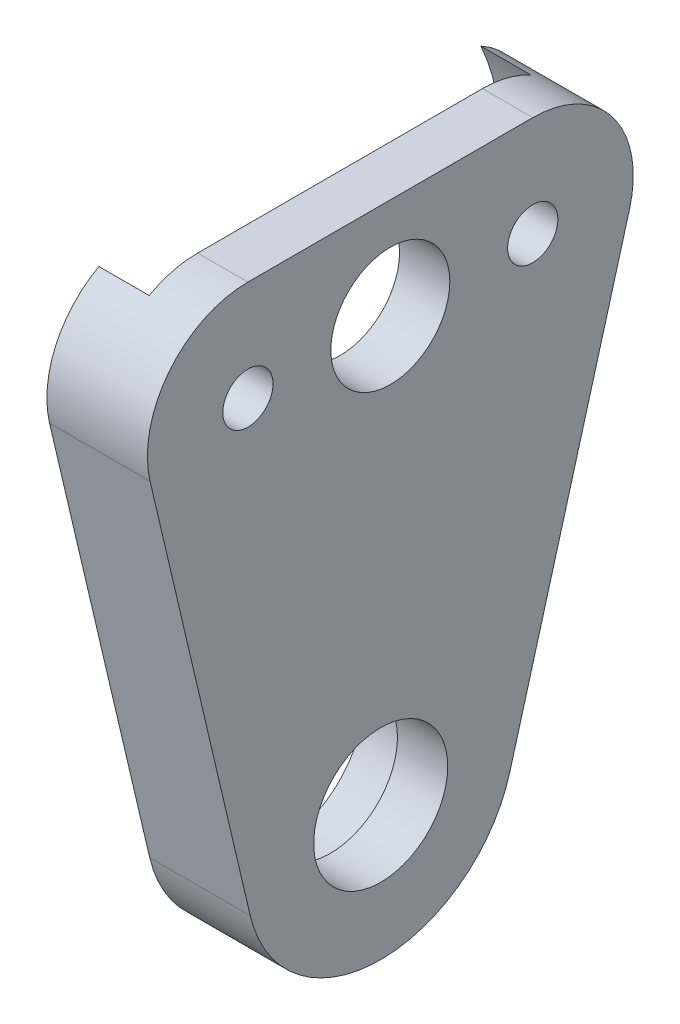
ISO-10303-21;
HEADER;
FILE_DESCRIPTION(('STEP AP214'),'2;1');
FILE_NAME('part.step','',(''),(''),'','','');
FILE_SCHEMA(('AUTOMOTIVE_DESIGN { 1 0 10303 214 1 1 1 1 }'));
ENDSEC;
DATA;
#1=APPLICATION_CONTEXT('core data for automotive mechanical design processes');
#2=APPLICATION_PROTOCOL_DEFINITION('international standard','automotive_design',2000,#1);
#3=PRODUCT_CONTEXT('',#1,'mechanical');
#4=PRODUCT('Part','Part','',(#3));
#5=PRODUCT_RELATED_PRODUCT_CATEGORY('part','',(#4));
#6=PRODUCT_DEFINITION_FORMATION('','',#4);
#7=PRODUCT_DEFINITION_CONTEXT('part definition',#1,'design');
#8=PRODUCT_DEFINITION('design','',#6,#7);
#9=PRODUCT_DEFINITION_SHAPE('','',#8);
#10=(LENGTH_UNIT() NAMED_UNIT(*) SI_UNIT(.MILLI.,.METRE.));
#11=(NAMED_UNIT(*) PLANE_ANGLE_UNIT() SI_UNIT($,.RADIAN.));
#12=(NAMED_UNIT(*) SI_UNIT($,.STERADIAN.) SOLID_ANGLE_UNIT());
#13=UNCERTAINTY_MEASURE_WITH_UNIT(LENGTH_MEASURE(1.E-05),#10,'distance_accuracy_value','');
#14=(GEOMETRIC_REPRESENTATION_CONTEXT(3) GLOBAL_UNCERTAINTY_ASSIGNED_CONTEXT((#13)) GLOBAL_UNIT_ASSIGNED_CONTEXT((#10,
#11,#12)) REPRESENTATION_CONTEXT('',''));
#15=CARTESIAN_POINT('',(0.,0.,0.));
#16=DIRECTION('',(0.,0.,1.));
#17=DIRECTION('',(1.,0.,0.));
#18=AXIS2_PLACEMENT_3D('',#15,#16,#17);
#19=CARTESIAN_POINT('',(0.,12.,-30.4317121994613));
#20=DIRECTION('',(1.,0.,0.));
#21=DIRECTION('',(0.,0.,-1.));
#22=AXIS2_PLACEMENT_3D('',#19,#20,#21);
#23=PLANE('',#22);
#24=CARTESIAN_POINT('',(0.,-12.9934199132226,-21.3581609451439));
#25=DIRECTION('',(1.,0.,0.));
#26=DIRECTION('',(0.,0.,-1.));
#27=AXIS2_PLACEMENT_3D('',#24,#25,#26);
#28=CIRCLE('',#27,4.99);
#29=CARTESIAN_POINT('',(0.,-12.9934199132226,-26.3481609451439));
#30=VERTEX_POINT('',#29);
#31=EDGE_CURVE('E176',#30,#30,#28,.T.);
#32=ORIENTED_EDGE('',*,*,#31,.T.);
#33=EDGE_LOOP('',(#32));
#34=FACE_BOUND('',#33,.T.);
#35=CARTESIAN_POINT('',(0.,12.,-21.9317121994613));
#36=DIRECTION('',(1.,0.,0.));
#37=DIRECTION('',(0.,0.,-1.));
#38=AXIS2_PLACEMENT_3D('',#35,#36,#37);
#39=CIRCLE('',#38,12.55);
#40=CARTESIAN_POINT('',(0.,17.2541600732429,-10.5345063171084));
#41=VERTEX_POINT('',#40);
#42=CARTESIAN_POINT('',(0.,17.2541600732429,-33.3289180818143));
#43=VERTEX_POINT('',#42);
#44=EDGE_CURVE('E154',#41,#43,#39,.T.);
#45=ORIENTED_EDGE('',*,*,#44,.T.);
#46=CARTESIAN_POINT('',(0.,12.,-30.4317121994613));
#47=DIRECTION('',(1.,0.,0.));
#48=DIRECTION('',(0.,0.,-1.));
#49=AXIS2_PLACEMENT_3D('',#46,#47,#48);
#50=CIRCLE('',#49,5.99999999999999);
#51=CARTESIAN_POINT('',(0.,10.3825409032938,-36.2095860359588));
#52=VERTEX_POINT('',#51);
#53=EDGE_CURVE('E124',#52,#43,#50,.T.);
#54=ORIENTED_EDGE('',*,*,#53,.F.);
#55=DIRECTION('',(0.,0.962978972749584,-0.269576516117699));
#56=VECTOR('',#55,1.);
#57=CARTESIAN_POINT('',(0.,-15.1500320421642,-29.0619927271406));
#58=LINE('',#57,#56);
#59=CARTESIAN_POINT('',(0.,-15.1500320421642,-29.0619927271406));
#60=VERTEX_POINT('',#59);
#61=EDGE_CURVE('E77',#60,#52,#58,.T.);
#62=ORIENTED_EDGE('',*,*,#61,.F.);
#63=CARTESIAN_POINT('',(0.,-12.9934199132226,-21.3581609451439));
#64=DIRECTION('',(1.,0.,0.));
#65=DIRECTION('',(0.,0.,-1.));
#66=AXIS2_PLACEMENT_3D('',#63,#64,#65);
#67=CIRCLE('',#66,8.);
#68=CARTESIAN_POINT('',(0.,-14.823132675457,-13.5702118436335));
#69=VERTEX_POINT('',#68);
#70=EDGE_CURVE('E131',#69,#60,#67,.T.);
#71=ORIENTED_EDGE('',*,*,#70,.F.);
#72=DIRECTION('',(0.,-0.973493637688799,-0.228714095279301));
#73=VECTOR('',#72,1.);
#74=CARTESIAN_POINT('',(0.,10.6277154283242,-7.59075037332852));
#75=LINE('',#74,#73);
#76=CARTESIAN_POINT('',(0.,10.6277154283242,-7.59075037332852));
#77=VERTEX_POINT('',#76);
#78=EDGE_CURVE('E112',#77,#69,#75,.T.);
#79=ORIENTED_EDGE('',*,*,#78,.F.);
#80=CARTESIAN_POINT('',(0.,12.,-13.4317121994613));
#81=DIRECTION('',(1.,0.,0.));
#82=DIRECTION('',(0.,0.,-1.));
#83=AXIS2_PLACEMENT_3D('',#80,#81,#82);
#84=CIRCLE('',#83,5.99999999999999);
#85=EDGE_CURVE('E127',#41,#77,#84,.T.);
#86=ORIENTED_EDGE('',*,*,#85,.F.);
#87=EDGE_LOOP('',(#45,#54,#62,#71,#79,#86));
#88=FACE_BOUND('',#87,.T.);
#89=ADVANCED_FACE('F33',(#34,#88),#23,.F.);
#90=CARTESIAN_POINT('',(6.,12.,-30.4317121994613));
#91=DIRECTION('',(-1.,0.,0.));
#92=DIRECTION('',(0.,0.,1.));
#93=AXIS2_PLACEMENT_3D('',#90,#91,#92);
#94=CYLINDRICAL_SURFACE('',#93,5.99999999999999);
#95=DIRECTION('',(-1.,0.,0.));
#96=VECTOR('',#95,1.);
#97=CARTESIAN_POINT('',(1.5,17.2541600732429,-33.3289180818143));
#98=LINE('',#97,#96);
#99=CARTESIAN_POINT('',(3.,17.2541600732429,-33.3289180818143));
#100=VERTEX_POINT('',#99);
#101=EDGE_CURVE('E174',#100,#43,#98,.T.);
#102=ORIENTED_EDGE('',*,*,#101,.F.);
#103=CARTESIAN_POINT('',(3.,12.,-30.4317121994613));
#104=DIRECTION('',(1.,0.,0.));
#105=DIRECTION('',(0.,0.,-1.));
#106=AXIS2_PLACEMENT_3D('',#103,#104,#105);
#107=CIRCLE('',#106,5.99999999999999);
#108=CARTESIAN_POINT('',(3.,18.,-30.4317121994613));
#109=VERTEX_POINT('',#108);
#110=EDGE_CURVE('E171',#100,#109,#107,.T.);
#111=ORIENTED_EDGE('',*,*,#110,.T.);
#112=DIRECTION('',(-1.,0.,0.));
#113=VECTOR('',#112,1.);
#114=CARTESIAN_POINT('',(6.,18.,-30.4317121994613));
#115=LINE('',#114,#113);
#116=CARTESIAN_POINT('',(6.,18.,-30.4317121994613));
#117=VERTEX_POINT('',#116);
#118=EDGE_CURVE('E41',#117,#109,#115,.T.);
#119=ORIENTED_EDGE('',*,*,#118,.F.);
#120=CARTESIAN_POINT('',(6.,12.,-30.4317121994613));
#121=DIRECTION('',(1.,0.,0.));
#122=DIRECTION('',(0.,0.,-1.));
#123=AXIS2_PLACEMENT_3D('',#120,#121,#122);
#124=CIRCLE('',#123,5.99999999999999);
#125=CARTESIAN_POINT('',(6.,10.3825409032938,-36.2095860359588));
#126=VERTEX_POINT('',#125);
#127=EDGE_CURVE('E134',#126,#117,#124,.T.);
#128=ORIENTED_EDGE('',*,*,#127,.F.);
#129=DIRECTION('',(-1.,0.,0.));
#130=VECTOR('',#129,1.);
#131=CARTESIAN_POINT('',(6.,10.3825409032938,-36.2095860359588));
#132=LINE('',#131,#130);
#133=EDGE_CURVE('E120',#126,#52,#132,.T.);
#134=ORIENTED_EDGE('',*,*,#133,.T.);
#135=ORIENTED_EDGE('',*,*,#53,.T.);
#136=EDGE_LOOP('',(#102,#111,#119,#128,#134,#135));
#137=FACE_BOUND('',#136,.T.);
#138=ADVANCED_FACE('F35',(#137),#94,.T.);
#139=CARTESIAN_POINT('',(6.,12.,-13.4317121994613));
#140=DIRECTION('',(-1.,0.,0.));
#141=DIRECTION('',(0.,0.,1.));
#142=AXIS2_PLACEMENT_3D('',#139,#140,#141);
#143=CYLINDRICAL_SURFACE('',#142,5.99999999999999);
#144=DIRECTION('',(-1.,0.,0.));
#145=VECTOR('',#144,1.);
#146=CARTESIAN_POINT('',(1.5,17.2541600732429,-10.5345063171084));
#147=LINE('',#146,#145);
#148=CARTESIAN_POINT('',(3.,17.2541600732429,-10.5345063171084));
#149=VERTEX_POINT('',#148);
#150=EDGE_CURVE('E11',#41,#149,#147,.F.);
#151=ORIENTED_EDGE('',*,*,#150,.F.);
#152=ORIENTED_EDGE('',*,*,#85,.T.);
#153=DIRECTION('',(-1.,0.,0.));
#154=VECTOR('',#153,1.);
#155=CARTESIAN_POINT('',(6.,10.6277154283242,-7.59075037332852));
#156=LINE('',#155,#154);
#157=CARTESIAN_POINT('',(6.,10.6277154283242,-7.59075037332852));
#158=VERTEX_POINT('',#157);
#159=EDGE_CURVE('E115',#158,#77,#156,.T.);
#160=ORIENTED_EDGE('',*,*,#159,.F.);
#161=CARTESIAN_POINT('',(6.,12.,-13.4317121994613));
#162=DIRECTION('',(1.,0.,0.));
#163=DIRECTION('',(0.,0.,-1.));
#164=AXIS2_PLACEMENT_3D('',#161,#162,#163);
#165=CIRCLE('',#164,5.99999999999999);
#166=CARTESIAN_POINT('',(6.,18.,-13.4317121994613));
#167=VERTEX_POINT('',#166);
#168=EDGE_CURVE('E103',#167,#158,#165,.T.);
#169=ORIENTED_EDGE('',*,*,#168,.F.);
#170=DIRECTION('',(-1.,0.,0.));
#171=VECTOR('',#170,1.);
#172=CARTESIAN_POINT('',(6.,18.,-13.4317121994613));
#173=LINE('',#172,#171);
#174=CARTESIAN_POINT('',(3.,18.,-13.4317121994613));
#175=VERTEX_POINT('',#174);
#176=EDGE_CURVE('E138',#167,#175,#173,.T.);
#177=ORIENTED_EDGE('',*,*,#176,.T.);
#178=CARTESIAN_POINT('',(3.,12.,-13.4317121994613));
#179=DIRECTION('',(1.,0.,0.));
#180=DIRECTION('',(0.,0.,-1.));
#181=AXIS2_PLACEMENT_3D('',#178,#179,#180);
#182=CIRCLE('',#181,5.99999999999999);
#183=EDGE_CURVE('E165',#175,#149,#182,.T.);
#184=ORIENTED_EDGE('',*,*,#183,.T.);
#185=EDGE_LOOP('',(#151,#152,#160,#169,#177,#184));
#186=FACE_BOUND('',#185,.T.);
#187=ADVANCED_FACE('F199',(#186),#143,.T.);
#188=CARTESIAN_POINT('',(6.,12.,-30.4317121994613));
#189=DIRECTION('',(1.,0.,0.));
#190=DIRECTION('',(0.,0.,-1.));
#191=AXIS2_PLACEMENT_3D('',#188,#189,#190);
#192=PLANE('',#191);
#193=CARTESIAN_POINT('',(6.,12.,-13.4317121994613));
#194=DIRECTION('',(1.,0.,0.));
#195=DIRECTION('',(0.,0.,-1.));
#196=AXIS2_PLACEMENT_3D('',#193,#194,#195);
#197=CIRCLE('',#196,1.5);
#198=CARTESIAN_POINT('',(6.,12.,-14.9317121994613));
#199=VERTEX_POINT('',#198);
#200=EDGE_CURVE('E183',#199,#199,#197,.T.);
#201=ORIENTED_EDGE('',*,*,#200,.F.);
#202=EDGE_LOOP('',(#201));
#203=FACE_BOUND('',#202,.T.);
#204=CARTESIAN_POINT('',(6.,12.,-21.9317121994613));
#205=DIRECTION('',(1.,0.,0.));
#206=DIRECTION('',(0.,0.,-1.));
#207=AXIS2_PLACEMENT_3D('',#204,#205,#206);
#208=CIRCLE('',#207,3.54999999999999);
#209=CARTESIAN_POINT('',(6.,12.,-25.4817121994613));
#210=VERTEX_POINT('',#209);
#211=EDGE_CURVE('E128',#210,#210,#208,.T.);
#212=ORIENTED_EDGE('',*,*,#211,.F.);
#213=EDGE_LOOP('',(#212));
#214=FACE_BOUND('',#213,.T.);
#215=ORIENTED_EDGE('',*,*,#127,.T.);
#216=DIRECTION('',(0.,0.,1.));
#217=VECTOR('',#216,1.);
#218=CARTESIAN_POINT('',(6.,18.,-30.4317121994613));
#219=LINE('',#218,#217);
#220=EDGE_CURVE('E86',#117,#167,#219,.T.);
#221=ORIENTED_EDGE('',*,*,#220,.T.);
#222=ORIENTED_EDGE('',*,*,#168,.T.);
#223=DIRECTION('',(0.,-0.973493637688799,-0.228714095279301));
#224=VECTOR('',#223,1.);
#225=CARTESIAN_POINT('',(6.,10.6277154283242,-7.59075037332852));
#226=LINE('',#225,#224);
#227=CARTESIAN_POINT('',(6.,-14.823132675457,-13.5702118436335));
#228=VERTEX_POINT('',#227);
#229=EDGE_CURVE('E95',#158,#228,#226,.T.);
#230=ORIENTED_EDGE('',*,*,#229,.T.);
#231=CARTESIAN_POINT('',(6.,-12.9934199132226,-21.3581609451439));
#232=DIRECTION('',(1.,0.,0.));
#233=DIRECTION('',(0.,0.,-1.));
#234=AXIS2_PLACEMENT_3D('',#231,#232,#233);
#235=CIRCLE('',#234,8.);
#236=CARTESIAN_POINT('',(6.,-15.1500320421642,-29.0619927271406));
#237=VERTEX_POINT('',#236);
#238=EDGE_CURVE('E100',#228,#237,#235,.T.);
#239=ORIENTED_EDGE('',*,*,#238,.T.);
#240=DIRECTION('',(0.,0.962978972749584,-0.269576516117699));
#241=VECTOR('',#240,1.);
#242=CARTESIAN_POINT('',(6.,-15.1500320421642,-29.0619927271406));
#243=LINE('',#242,#241);
#244=EDGE_CURVE('E56',#237,#126,#243,.T.);
#245=ORIENTED_EDGE('',*,*,#244,.T.);
#246=EDGE_LOOP('',(#215,#221,#222,#230,#239,#245));
#247=FACE_BOUND('',#246,.T.);
#248=CARTESIAN_POINT('',(6.,12.,-30.4317121994613));
#249=DIRECTION('',(1.,0.,0.));
#250=DIRECTION('',(0.,0.,-1.));
#251=AXIS2_PLACEMENT_3D('',#248,#249,#250);
#252=CIRCLE('',#251,1.50000000000001);
#253=CARTESIAN_POINT('',(6.,12.,-31.9317121994613));
#254=VERTEX_POINT('',#253);
#255=EDGE_CURVE('E186',#254,#254,#252,.T.);
#256=ORIENTED_EDGE('',*,*,#255,.F.);
#257=EDGE_LOOP('',(#256));
#258=FACE_BOUND('',#257,.T.);
#259=CARTESIAN_POINT('',(6.,-12.9934199132226,-21.3581609451439));
#260=DIRECTION('',(1.,0.,0.));
#261=DIRECTION('',(0.,0.,-1.));
#262=AXIS2_PLACEMENT_3D('',#259,#260,#261);
#263=CIRCLE('',#262,4.);
#264=CARTESIAN_POINT('',(6.,-12.9934199132226,-25.3581609451439));
#265=VERTEX_POINT('',#264);
#266=EDGE_CURVE('E144',#265,#265,#263,.T.);
#267=ORIENTED_EDGE('',*,*,#266,.F.);
#268=EDGE_LOOP('',(#267));
#269=FACE_BOUND('',#268,.T.);
#270=ADVANCED_FACE('F97',(#203,#214,#247,#258,#269),#192,.T.);
#271=CARTESIAN_POINT('',(6.,18.,-30.4317121994613));
#272=DIRECTION('',(0.,-1.,0.));
#273=DIRECTION('',(0.,0.,-1.));
#274=AXIS2_PLACEMENT_3D('',#271,#272,#273);
#275=PLANE('',#274);
#276=ORIENTED_EDGE('',*,*,#118,.T.);
#277=DIRECTION('',(0.,0.,1.));
#278=VECTOR('',#277,1.);
#279=CARTESIAN_POINT('',(3.,18.,-30.4317121994613));
#280=LINE('',#279,#278);
#281=EDGE_CURVE('E168',#109,#175,#280,.T.);
#282=ORIENTED_EDGE('',*,*,#281,.T.);
#283=ORIENTED_EDGE('',*,*,#176,.F.);
#284=ORIENTED_EDGE('',*,*,#220,.F.);
#285=EDGE_LOOP('',(#276,#282,#283,#284));
#286=FACE_BOUND('',#285,.T.);
#287=ADVANCED_FACE('F194',(#286),#275,.F.);
#288=CARTESIAN_POINT('',(6.,10.6277154283242,-7.59075037332852));
#289=DIRECTION('',(0.,0.228714095279301,-0.973493637688799));
#290=DIRECTION('',(0.,0.973493637688799,0.228714095279301));
#291=AXIS2_PLACEMENT_3D('',#288,#289,#290);
#292=PLANE('',#291);
#293=ORIENTED_EDGE('',*,*,#78,.T.);
#294=DIRECTION('',(-1.,0.,0.));
#295=VECTOR('',#294,1.);
#296=CARTESIAN_POINT('',(6.,-14.823132675457,-13.5702118436335));
#297=LINE('',#296,#295);
#298=EDGE_CURVE('E109',#228,#69,#297,.T.);
#299=ORIENTED_EDGE('',*,*,#298,.F.);
#300=ORIENTED_EDGE('',*,*,#229,.F.);
#301=ORIENTED_EDGE('',*,*,#159,.T.);
#302=EDGE_LOOP('',(#293,#299,#300,#301));
#303=FACE_BOUND('',#302,.T.);
#304=ADVANCED_FACE('F110',(#303),#292,.F.);
#305=CARTESIAN_POINT('',(6.,-12.9934199132226,-21.3581609451439));
#306=DIRECTION('',(-1.,0.,0.));
#307=DIRECTION('',(0.,0.,1.));
#308=AXIS2_PLACEMENT_3D('',#305,#306,#307);
#309=CYLINDRICAL_SURFACE('',#308,8.);
#310=ORIENTED_EDGE('',*,*,#70,.T.);
#311=DIRECTION('',(-1.,0.,0.));
#312=VECTOR('',#311,1.);
#313=CARTESIAN_POINT('',(6.,-15.1500320421642,-29.0619927271406));
#314=LINE('',#313,#312);
#315=EDGE_CURVE('E116',#237,#60,#314,.T.);
#316=ORIENTED_EDGE('',*,*,#315,.F.);
#317=ORIENTED_EDGE('',*,*,#238,.F.);
#318=ORIENTED_EDGE('',*,*,#298,.T.);
#319=EDGE_LOOP('',(#310,#316,#317,#318));
#320=FACE_BOUND('',#319,.T.);
#321=ADVANCED_FACE('F118',(#320),#309,.T.);
#322=CARTESIAN_POINT('',(6.,-15.1500320421642,-29.0619927271406));
#323=DIRECTION('',(0.,0.269576516117699,0.962978972749584));
#324=DIRECTION('',(0.,-0.962978972749584,0.269576516117699));
#325=AXIS2_PLACEMENT_3D('',#322,#323,#324);
#326=PLANE('',#325);
#327=ORIENTED_EDGE('',*,*,#61,.T.);
#328=ORIENTED_EDGE('',*,*,#133,.F.);
#329=ORIENTED_EDGE('',*,*,#244,.F.);
#330=ORIENTED_EDGE('',*,*,#315,.T.);
#331=EDGE_LOOP('',(#327,#328,#329,#330));
#332=FACE_BOUND('',#331,.T.);
#333=ADVANCED_FACE('F204',(#332),#326,.F.);
#334=CARTESIAN_POINT('',(6.,12.,-21.9317121994613));
#335=DIRECTION('',(-1.,0.,0.));
#336=DIRECTION('',(0.,0.,1.));
#337=AXIS2_PLACEMENT_3D('',#334,#335,#336);
#338=CYLINDRICAL_SURFACE('',#337,3.54999999999999);
#339=CARTESIAN_POINT('',(3.,12.,-21.9317121994613));
#340=DIRECTION('',(1.,0.,0.));
#341=DIRECTION('',(0.,0.,-1.));
#342=AXIS2_PLACEMENT_3D('',#339,#340,#341);
#343=CIRCLE('',#342,3.54999999999999);
#344=CARTESIAN_POINT('',(3.,12.,-25.4817121994613));
#345=VERTEX_POINT('',#344);
#346=EDGE_CURVE('E152',#345,#345,#343,.T.);
#347=ORIENTED_EDGE('',*,*,#346,.F.);
#348=EDGE_LOOP('',(#347));
#349=FACE_BOUND('',#348,.T.);
#350=ORIENTED_EDGE('',*,*,#211,.T.);
#351=EDGE_LOOP('',(#350));
#352=FACE_BOUND('',#351,.T.);
#353=ADVANCED_FACE('F235',(#349,#352),#338,.F.);
#354=CARTESIAN_POINT('',(6.,12.,-30.4317121994613));
#355=DIRECTION('',(-1.,0.,0.));
#356=DIRECTION('',(0.,0.,1.));
#357=AXIS2_PLACEMENT_3D('',#354,#355,#356);
#358=CYLINDRICAL_SURFACE('',#357,1.50000000000001);
#359=CARTESIAN_POINT('',(3.,12.,-30.4317121994613));
#360=DIRECTION('',(1.,0.,0.));
#361=DIRECTION('',(0.,0.,-1.));
#362=AXIS2_PLACEMENT_3D('',#359,#360,#361);
#363=CIRCLE('',#362,1.50000000000001);
#364=CARTESIAN_POINT('',(3.,12.,-31.9317121994613));
#365=VERTEX_POINT('',#364);
#366=EDGE_CURVE('E148',#365,#365,#363,.T.);
#367=ORIENTED_EDGE('',*,*,#366,.F.);
#368=EDGE_LOOP('',(#367));
#369=FACE_BOUND('',#368,.T.);
#370=ORIENTED_EDGE('',*,*,#255,.T.);
#371=EDGE_LOOP('',(#370));
#372=FACE_BOUND('',#371,.T.);
#373=ADVANCED_FACE('F253',(#369,#372),#358,.F.);
#374=CARTESIAN_POINT('',(6.,12.,-13.4317121994613));
#375=DIRECTION('',(-1.,0.,0.));
#376=DIRECTION('',(0.,0.,1.));
#377=AXIS2_PLACEMENT_3D('',#374,#375,#376);
#378=CYLINDRICAL_SURFACE('',#377,1.5);
#379=CARTESIAN_POINT('',(3.,12.,-13.4317121994613));
#380=DIRECTION('',(1.,0.,0.));
#381=DIRECTION('',(0.,0.,-1.));
#382=AXIS2_PLACEMENT_3D('',#379,#380,#381);
#383=CIRCLE('',#382,1.5);
#384=CARTESIAN_POINT('',(3.,12.,-14.9317121994613));
#385=VERTEX_POINT('',#384);
#386=EDGE_CURVE('E146',#385,#385,#383,.T.);
#387=ORIENTED_EDGE('',*,*,#386,.F.);
#388=EDGE_LOOP('',(#387));
#389=FACE_BOUND('',#388,.T.);
#390=ORIENTED_EDGE('',*,*,#200,.T.);
#391=EDGE_LOOP('',(#390));
#392=FACE_BOUND('',#391,.T.);
#393=ADVANCED_FACE('F258',(#389,#392),#378,.F.);
#394=CARTESIAN_POINT('',(6.,-12.9934199132226,-21.3581609451439));
#395=DIRECTION('',(-1.,0.,0.));
#396=DIRECTION('',(0.,0.,1.));
#397=AXIS2_PLACEMENT_3D('',#394,#395,#396);
#398=CYLINDRICAL_SURFACE('',#397,4.);
#399=CARTESIAN_POINT('',(3.,-12.9934199132226,-21.3581609451439));
#400=DIRECTION('',(1.,0.,0.));
#401=DIRECTION('',(0.,0.,-1.));
#402=AXIS2_PLACEMENT_3D('',#399,#400,#401);
#403=CIRCLE('',#402,4.);
#404=CARTESIAN_POINT('',(3.,-12.9934199132226,-25.3581609451439));
#405=VERTEX_POINT('',#404);
#406=EDGE_CURVE('E142',#405,#405,#403,.T.);
#407=ORIENTED_EDGE('',*,*,#406,.F.);
#408=EDGE_LOOP('',(#407));
#409=FACE_BOUND('',#408,.T.);
#410=ORIENTED_EDGE('',*,*,#266,.T.);
#411=EDGE_LOOP('',(#410));
#412=FACE_BOUND('',#411,.T.);
#413=ADVANCED_FACE('F265',(#409,#412),#398,.F.);
#414=CARTESIAN_POINT('',(3.,-12.9934199132226,-21.3581609451439));
#415=DIRECTION('',(-1.,0.,0.));
#416=DIRECTION('',(0.,0.,1.));
#417=AXIS2_PLACEMENT_3D('',#414,#415,#416);
#418=CYLINDRICAL_SURFACE('',#417,4.99);
#419=CARTESIAN_POINT('',(3.,-12.9934199132226,-21.3581609451439));
#420=DIRECTION('',(1.,0.,0.));
#421=DIRECTION('',(0.,0.,-1.));
#422=AXIS2_PLACEMENT_3D('',#419,#420,#421);
#423=CIRCLE('',#422,4.99);
#424=CARTESIAN_POINT('',(3.,-12.9934199132226,-26.3481609451439));
#425=VERTEX_POINT('',#424);
#426=EDGE_CURVE('E145',#425,#425,#423,.T.);
#427=ORIENTED_EDGE('',*,*,#426,.T.);
#428=EDGE_LOOP('',(#427));
#429=FACE_BOUND('',#428,.T.);
#430=ORIENTED_EDGE('',*,*,#31,.F.);
#431=EDGE_LOOP('',(#430));
#432=FACE_BOUND('',#431,.T.);
#433=ADVANCED_FACE('F221',(#429,#432),#418,.F.);
#434=CARTESIAN_POINT('',(3.,-12.9934199132226,-21.3581609451439));
#435=DIRECTION('',(1.,0.,0.));
#436=DIRECTION('',(0.,0.,-1.));
#437=AXIS2_PLACEMENT_3D('',#434,#435,#436);
#438=PLANE('',#437);
#439=ORIENTED_EDGE('',*,*,#406,.T.);
#440=EDGE_LOOP('',(#439));
#441=FACE_BOUND('',#440,.T.);
#442=ORIENTED_EDGE('',*,*,#426,.F.);
#443=EDGE_LOOP('',(#442));
#444=FACE_BOUND('',#443,.T.);
#445=ADVANCED_FACE('F214',(#441,#444),#438,.F.);
#446=CARTESIAN_POINT('',(3.,12.,-21.9317121994613));
#447=DIRECTION('',(-1.,0.,0.));
#448=DIRECTION('',(0.,0.,1.));
#449=AXIS2_PLACEMENT_3D('',#446,#447,#448);
#450=CYLINDRICAL_SURFACE('',#449,12.55);
#451=ORIENTED_EDGE('',*,*,#101,.T.);
#452=ORIENTED_EDGE('',*,*,#44,.F.);
#453=ORIENTED_EDGE('',*,*,#150,.T.);
#454=CARTESIAN_POINT('',(3.,12.,-21.9317121994613));
#455=DIRECTION('',(1.,0.,0.));
#456=DIRECTION('',(0.,0.,-1.));
#457=AXIS2_PLACEMENT_3D('',#454,#455,#456);
#458=CIRCLE('',#457,12.55);
#459=EDGE_CURVE('E48',#149,#100,#458,.T.);
#460=ORIENTED_EDGE('',*,*,#459,.T.);
#461=EDGE_LOOP('',(#451,#452,#453,#460));
#462=FACE_BOUND('',#461,.T.);
#463=ADVANCED_FACE('F211',(#462),#450,.F.);
#464=CARTESIAN_POINT('',(3.,12.,-21.9317121994613));
#465=DIRECTION('',(1.,0.,0.));
#466=DIRECTION('',(0.,0.,-1.));
#467=AXIS2_PLACEMENT_3D('',#464,#465,#466);
#468=PLANE('',#467);
#469=ORIENTED_EDGE('',*,*,#386,.T.);
#470=EDGE_LOOP('',(#469));
#471=FACE_BOUND('',#470,.T.);
#472=ORIENTED_EDGE('',*,*,#366,.T.);
#473=EDGE_LOOP('',(#472));
#474=FACE_BOUND('',#473,.T.);
#475=ORIENTED_EDGE('',*,*,#346,.T.);
#476=EDGE_LOOP('',(#475));
#477=FACE_BOUND('',#476,.T.);
#478=ORIENTED_EDGE('',*,*,#459,.F.);
#479=ORIENTED_EDGE('',*,*,#183,.F.);
#480=ORIENTED_EDGE('',*,*,#281,.F.);
#481=ORIENTED_EDGE('',*,*,#110,.F.);
#482=EDGE_LOOP('',(#478,#479,#480,#481));
#483=FACE_BOUND('',#482,.T.);
#484=ADVANCED_FACE('F213',(#471,#474,#477,#483),#468,.F.);
#485=CLOSED_SHELL('',(#89,#138,#187,#270,#287,#304,#321,#333,#353,#373,#393,#413,#433,#445,#463,#484));
#486=MANIFOLD_SOLID_BREP('B2',#485);
#487=ADVANCED_BREP_SHAPE_REPRESENTATION('',(#18,#486),#14);
#488=SHAPE_DEFINITION_REPRESENTATION(#9,#487);
ENDSEC;
END-ISO-10303-21;
